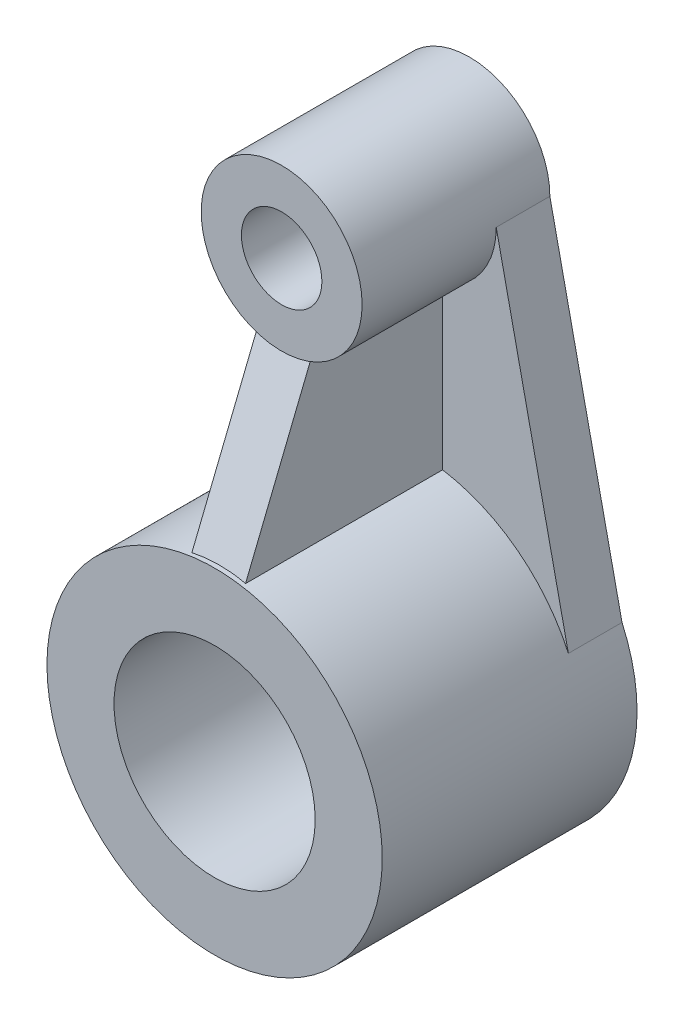
ISO-10303-21;
HEADER;
FILE_DESCRIPTION(('STEP AP214'),'2;1');
FILE_NAME('part.step','',(''),(''),'','','');
FILE_SCHEMA(('AUTOMOTIVE_DESIGN { 1 0 10303 214 1 1 1 1 }'));
ENDSEC;
DATA;
#1=APPLICATION_CONTEXT('core data for automotive mechanical design processes');
#2=APPLICATION_PROTOCOL_DEFINITION('international standard','automotive_design',2000,#1);
#3=PRODUCT_CONTEXT('',#1,'mechanical');
#4=PRODUCT('Part','Part','',(#3));
#5=PRODUCT_RELATED_PRODUCT_CATEGORY('part','',(#4));
#6=PRODUCT_DEFINITION_FORMATION('','',#4);
#7=PRODUCT_DEFINITION_CONTEXT('part definition',#1,'design');
#8=PRODUCT_DEFINITION('design','',#6,#7);
#9=PRODUCT_DEFINITION_SHAPE('','',#8);
#10=(LENGTH_UNIT() NAMED_UNIT(*) SI_UNIT(.MILLI.,.METRE.));
#11=(NAMED_UNIT(*) PLANE_ANGLE_UNIT() SI_UNIT($,.RADIAN.));
#12=(NAMED_UNIT(*) SI_UNIT($,.STERADIAN.) SOLID_ANGLE_UNIT());
#13=UNCERTAINTY_MEASURE_WITH_UNIT(LENGTH_MEASURE(1.E-05),#10,'distance_accuracy_value','');
#14=(GEOMETRIC_REPRESENTATION_CONTEXT(3) GLOBAL_UNCERTAINTY_ASSIGNED_CONTEXT((#13)) GLOBAL_UNIT_ASSIGNED_CONTEXT((#10,
#11,#12)) REPRESENTATION_CONTEXT('',''));
#15=CARTESIAN_POINT('',(0.,0.,0.));
#16=DIRECTION('',(0.,0.,1.));
#17=DIRECTION('',(1.,0.,0.));
#18=AXIS2_PLACEMENT_3D('',#15,#16,#17);
#19=CARTESIAN_POINT('',(0.,0.,-30.));
#20=DIRECTION('',(0.,0.,-1.));
#21=DIRECTION('',(-1.,0.,0.));
#22=AXIS2_PLACEMENT_3D('',#19,#20,#21);
#23=PLANE('',#22);
#24=DIRECTION('',(0.,-1.,0.));
#25=VECTOR('',#24,1.);
#26=CARTESIAN_POINT('',(-4.,0.,-30.));
#27=LINE('',#26,#25);
#28=CARTESIAN_POINT('',(-4.,55.4123837121923,-30.));
#29=VERTEX_POINT('',#28);
#30=CARTESIAN_POINT('',(-4.,31.4040175696832,-30.));
#31=VERTEX_POINT('',#30);
#32=EDGE_CURVE('E116',#29,#31,#27,.T.);
#33=ORIENTED_EDGE('',*,*,#32,.F.);
#34=CARTESIAN_POINT('',(0.,66.726092211177,-30.));
#35=DIRECTION('',(0.,0.,-1.));
#36=DIRECTION('',(-1.,0.,0.));
#37=AXIS2_PLACEMENT_3D('',#34,#35,#36);
#38=CIRCLE('',#37,12.);
#39=CARTESIAN_POINT('',(-12.,66.7260922111771,-30.));
#40=VERTEX_POINT('',#39);
#41=EDGE_CURVE('E101',#40,#29,#38,.F.);
#42=ORIENTED_EDGE('',*,*,#41,.F.);
#43=DIRECTION('',(-0.211753347005806,-0.977323140026797,0.));
#44=VECTOR('',#43,1.);
#45=CARTESIAN_POINT('',(-25.2709875098748,5.47538062713954,-30.));
#46=LINE('',#45,#44);
#47=CARTESIAN_POINT('',(-22.7580260015919,17.073664511522,-30.));
#48=VERTEX_POINT('',#47);
#49=EDGE_CURVE('E143',#40,#48,#46,.T.);
#50=ORIENTED_EDGE('',*,*,#49,.T.);
#51=CARTESIAN_POINT('',(0.,6.72609221117705,-30.));
#52=DIRECTION('',(0.,0.,-1.));
#53=DIRECTION('',(-1.,0.,0.));
#54=AXIS2_PLACEMENT_3D('',#51,#52,#53);
#55=CIRCLE('',#54,25.);
#56=EDGE_CURVE('E117',#48,#31,#55,.T.);
#57=ORIENTED_EDGE('',*,*,#56,.T.);
#58=EDGE_LOOP('',(#33,#42,#50,#57));
#59=FACE_BOUND('',#58,.T.);
#60=ADVANCED_FACE('F39',(#59),#23,.F.);
#61=CARTESIAN_POINT('',(0.,6.72609221117705,-38.));
#62=DIRECTION('',(0.,0.,1.));
#63=DIRECTION('',(1.,0.,0.));
#64=AXIS2_PLACEMENT_3D('',#61,#62,#63);
#65=CYLINDRICAL_SURFACE('',#64,25.);
#66=DIRECTION('',(0.,0.,1.));
#67=VECTOR('',#66,1.);
#68=CARTESIAN_POINT('',(4.,31.4040175696832,-38.));
#69=LINE('',#68,#67);
#70=CARTESIAN_POINT('',(4.,31.4040175696832,-0.612969449853033));
#71=VERTEX_POINT('',#70);
#72=CARTESIAN_POINT('',(4.,31.4040175696832,-30.));
#73=VERTEX_POINT('',#72);
#74=EDGE_CURVE('E54',#71,#73,#69,.F.);
#75=ORIENTED_EDGE('',*,*,#74,.F.);
#76=CARTESIAN_POINT('',(0.,6.72609221117705,9.36442892342926));
#77=DIRECTION('',(0.,-0.374828433630018,-0.927094194428197));
#78=DIRECTION('',(0.,-0.927094194428197,0.374828433630018));
#79=AXIS2_PLACEMENT_3D('',#76,#77,#78);
#80=ELLIPSE('',#79,26.965976219298,25.);
#81=CARTESIAN_POINT('',(-4.,31.4040175696832,-0.612969449853036));
#82=VERTEX_POINT('',#81);
#83=EDGE_CURVE('E58',#71,#82,#80,.F.);
#84=ORIENTED_EDGE('',*,*,#83,.T.);
#85=DIRECTION('',(0.,0.,1.));
#86=VECTOR('',#85,1.);
#87=CARTESIAN_POINT('',(-4.,31.4040175696832,-38.));
#88=LINE('',#87,#86);
#89=EDGE_CURVE('E119',#82,#31,#88,.F.);
#90=ORIENTED_EDGE('',*,*,#89,.T.);
#91=ORIENTED_EDGE('',*,*,#56,.F.);
#92=DIRECTION('',(0.,0.,-1.));
#93=VECTOR('',#92,1.);
#94=CARTESIAN_POINT('',(-22.7580260015919,17.073664511522,-30.));
#95=LINE('',#94,#93);
#96=CARTESIAN_POINT('',(-22.7580260015919,17.073664511522,-38.));
#97=VERTEX_POINT('',#96);
#98=EDGE_CURVE('E146',#48,#97,#95,.T.);
#99=ORIENTED_EDGE('',*,*,#98,.T.);
#100=CARTESIAN_POINT('',(0.,6.72609221117705,-38.));
#101=DIRECTION('',(0.,0.,1.));
#102=DIRECTION('',(1.,0.,0.));
#103=AXIS2_PLACEMENT_3D('',#100,#101,#102);
#104=CIRCLE('',#103,25.);
#105=CARTESIAN_POINT('',(22.7580260015919,17.073664511522,-38.));
#106=VERTEX_POINT('',#105);
#107=EDGE_CURVE('E131',#97,#106,#104,.T.);
#108=ORIENTED_EDGE('',*,*,#107,.T.);
#109=DIRECTION('',(0.,0.,-1.));
#110=VECTOR('',#109,1.);
#111=CARTESIAN_POINT('',(22.7580260015919,17.073664511522,-30.));
#112=LINE('',#111,#110);
#113=CARTESIAN_POINT('',(22.7580260015919,17.073664511522,-30.));
#114=VERTEX_POINT('',#113);
#115=EDGE_CURVE('E142',#114,#106,#112,.T.);
#116=ORIENTED_EDGE('',*,*,#115,.F.);
#117=EDGE_CURVE('E160',#73,#114,#55,.T.);
#118=ORIENTED_EDGE('',*,*,#117,.F.);
#119=EDGE_LOOP('',(#75,#84,#90,#91,#99,#108,#116,#118));
#120=FACE_BOUND('',#119,.T.);
#121=CARTESIAN_POINT('',(0.,6.72609221117705,0.));
#122=DIRECTION('',(0.,0.,1.));
#123=DIRECTION('',(1.,0.,0.));
#124=AXIS2_PLACEMENT_3D('',#121,#122,#123);
#125=CIRCLE('',#124,25.);
#126=CARTESIAN_POINT('',(25.,6.72609221117705,0.));
#127=VERTEX_POINT('',#126);
#128=EDGE_CURVE('E128',#127,#127,#125,.T.);
#129=ORIENTED_EDGE('',*,*,#128,.F.);
#130=EDGE_LOOP('',(#129));
#131=FACE_BOUND('',#130,.T.);
#132=ADVANCED_FACE('F41',(#120,#131),#65,.T.);
#133=CARTESIAN_POINT('',(0.,6.72609221117705,-38.));
#134=DIRECTION('',(0.,0.,1.));
#135=DIRECTION('',(1.,0.,0.));
#136=AXIS2_PLACEMENT_3D('',#133,#134,#135);
#137=PLANE('',#136);
#138=DIRECTION('',(-0.211753347005806,-0.977323140026797,0.));
#139=VECTOR('',#138,1.);
#140=CARTESIAN_POINT('',(-25.2709875098748,5.47538062713954,-38.));
#141=LINE('',#140,#139);
#142=CARTESIAN_POINT('',(-12.,66.726092211177,-38.));
#143=VERTEX_POINT('',#142);
#144=EDGE_CURVE('E150',#143,#97,#141,.T.);
#145=ORIENTED_EDGE('',*,*,#144,.F.);
#146=CARTESIAN_POINT('',(0.,66.726092211177,-38.));
#147=DIRECTION('',(0.,0.,-1.));
#148=DIRECTION('',(-1.,0.,0.));
#149=AXIS2_PLACEMENT_3D('',#146,#147,#148);
#150=CIRCLE('',#149,12.);
#151=CARTESIAN_POINT('',(12.,66.726092211177,-38.));
#152=VERTEX_POINT('',#151);
#153=EDGE_CURVE('E171',#143,#152,#150,.T.);
#154=ORIENTED_EDGE('',*,*,#153,.T.);
#155=DIRECTION('',(-0.211753347005806,0.977323140026797,0.));
#156=VECTOR('',#155,1.);
#157=CARTESIAN_POINT('',(25.2709875098748,5.47538062713953,-38.));
#158=LINE('',#157,#156);
#159=EDGE_CURVE('E154',#106,#152,#158,.T.);
#160=ORIENTED_EDGE('',*,*,#159,.F.);
#161=ORIENTED_EDGE('',*,*,#107,.F.);
#162=EDGE_LOOP('',(#145,#154,#160,#161));
#163=FACE_BOUND('',#162,.T.);
#164=CARTESIAN_POINT('',(0.,6.72609221117705,-38.));
#165=DIRECTION('',(0.,0.,1.));
#166=DIRECTION('',(1.,0.,0.));
#167=AXIS2_PLACEMENT_3D('',#164,#165,#166);
#168=CIRCLE('',#167,15.);
#169=CARTESIAN_POINT('',(15.,6.72609221117705,-38.));
#170=VERTEX_POINT('',#169);
#171=EDGE_CURVE('E132',#170,#170,#168,.T.);
#172=ORIENTED_EDGE('',*,*,#171,.T.);
#173=EDGE_LOOP('',(#172));
#174=FACE_BOUND('',#173,.T.);
#175=CARTESIAN_POINT('',(0.,66.726092211177,-38.));
#176=DIRECTION('',(0.,0.,-1.));
#177=DIRECTION('',(-1.,0.,0.));
#178=AXIS2_PLACEMENT_3D('',#175,#176,#177);
#179=CIRCLE('',#178,6.);
#180=CARTESIAN_POINT('',(-5.99999999999999,66.726092211177,-38.));
#181=VERTEX_POINT('',#180);
#182=EDGE_CURVE('E168',#181,#181,#179,.F.);
#183=ORIENTED_EDGE('',*,*,#182,.T.);
#184=EDGE_LOOP('',(#183));
#185=FACE_BOUND('',#184,.T.);
#186=ADVANCED_FACE('F198',(#163,#174,#185),#137,.F.);
#187=CARTESIAN_POINT('',(0.,6.72609221117705,0.));
#188=DIRECTION('',(0.,0.,1.));
#189=DIRECTION('',(1.,0.,0.));
#190=AXIS2_PLACEMENT_3D('',#187,#188,#189);
#191=PLANE('',#190);
#192=CARTESIAN_POINT('',(0.,6.72609221117705,0.));
#193=DIRECTION('',(0.,0.,1.));
#194=DIRECTION('',(1.,0.,0.));
#195=AXIS2_PLACEMENT_3D('',#192,#193,#194);
#196=CIRCLE('',#195,15.);
#197=CARTESIAN_POINT('',(15.,6.72609221117705,0.));
#198=VERTEX_POINT('',#197);
#199=EDGE_CURVE('E134',#198,#198,#196,.T.);
#200=ORIENTED_EDGE('',*,*,#199,.F.);
#201=EDGE_LOOP('',(#200));
#202=FACE_BOUND('',#201,.T.);
#203=ORIENTED_EDGE('',*,*,#128,.T.);
#204=EDGE_LOOP('',(#203));
#205=FACE_BOUND('',#204,.T.);
#206=ADVANCED_FACE('F207',(#202,#205),#191,.T.);
#207=CARTESIAN_POINT('',(0.,6.72609221117705,-38.));
#208=DIRECTION('',(0.,0.,1.));
#209=DIRECTION('',(1.,0.,0.));
#210=AXIS2_PLACEMENT_3D('',#207,#208,#209);
#211=CYLINDRICAL_SURFACE('',#210,15.);
#212=ORIENTED_EDGE('',*,*,#171,.F.);
#213=EDGE_LOOP('',(#212));
#214=FACE_BOUND('',#213,.T.);
#215=ORIENTED_EDGE('',*,*,#199,.T.);
#216=EDGE_LOOP('',(#215));
#217=FACE_BOUND('',#216,.T.);
#218=ADVANCED_FACE('F209',(#214,#217),#211,.F.);
#219=CARTESIAN_POINT('',(-25.2709875098748,5.47538062713954,-30.));
#220=DIRECTION('',(0.977323140026797,-0.211753347005806,0.));
#221=DIRECTION('',(0.211753347005806,0.977323140026797,0.));
#222=AXIS2_PLACEMENT_3D('',#219,#220,#221);
#223=PLANE('',#222);
#224=ORIENTED_EDGE('',*,*,#144,.T.);
#225=ORIENTED_EDGE('',*,*,#98,.F.);
#226=ORIENTED_EDGE('',*,*,#49,.F.);
#227=DIRECTION('',(0.,0.,-1.));
#228=VECTOR('',#227,1.);
#229=CARTESIAN_POINT('',(-12.,66.7260922111771,-30.));
#230=LINE('',#229,#228);
#231=EDGE_CURVE('E108',#40,#143,#230,.T.);
#232=ORIENTED_EDGE('',*,*,#231,.T.);
#233=EDGE_LOOP('',(#224,#225,#226,#232));
#234=FACE_BOUND('',#233,.T.);
#235=ADVANCED_FACE('F202',(#234),#223,.F.);
#236=CARTESIAN_POINT('',(25.2709875098748,5.47538062713953,-30.));
#237=DIRECTION('',(-0.977323140026797,-0.211753347005806,0.));
#238=DIRECTION('',(0.211753347005806,-0.977323140026797,0.));
#239=AXIS2_PLACEMENT_3D('',#236,#237,#238);
#240=PLANE('',#239);
#241=ORIENTED_EDGE('',*,*,#159,.T.);
#242=DIRECTION('',(0.,0.,-1.));
#243=VECTOR('',#242,1.);
#244=CARTESIAN_POINT('',(12.,66.7260922111771,-30.));
#245=LINE('',#244,#243);
#246=CARTESIAN_POINT('',(12.,66.726092211177,-30.));
#247=VERTEX_POINT('',#246);
#248=EDGE_CURVE('E139',#247,#152,#245,.T.);
#249=ORIENTED_EDGE('',*,*,#248,.F.);
#250=DIRECTION('',(-0.211753347005806,0.977323140026797,0.));
#251=VECTOR('',#250,1.);
#252=CARTESIAN_POINT('',(25.2709875098748,5.47538062713953,-30.));
#253=LINE('',#252,#251);
#254=EDGE_CURVE('E153',#114,#247,#253,.T.);
#255=ORIENTED_EDGE('',*,*,#254,.F.);
#256=ORIENTED_EDGE('',*,*,#115,.T.);
#257=EDGE_LOOP('',(#241,#249,#255,#256));
#258=FACE_BOUND('',#257,.T.);
#259=ADVANCED_FACE('F194',(#258),#240,.F.);
#260=CARTESIAN_POINT('',(4.,55.4123837121923,-30.));
#261=VERTEX_POINT('',#260);
#262=EDGE_CURVE('E112',#261,#247,#38,.F.);
#263=ORIENTED_EDGE('',*,*,#262,.F.);
#264=DIRECTION('',(0.,-1.,0.));
#265=VECTOR('',#264,1.);
#266=CARTESIAN_POINT('',(4.,0.,-30.));
#267=LINE('',#266,#265);
#268=EDGE_CURVE('E175',#261,#73,#267,.T.);
#269=ORIENTED_EDGE('',*,*,#268,.T.);
#270=ORIENTED_EDGE('',*,*,#117,.T.);
#271=ORIENTED_EDGE('',*,*,#254,.T.);
#272=EDGE_LOOP('',(#263,#269,#270,#271));
#273=FACE_BOUND('',#272,.T.);
#274=ADVANCED_FACE('F190',(#273),#23,.F.);
#275=CARTESIAN_POINT('',(0.,66.726092211177,-10.));
#276=DIRECTION('',(0.,0.,-1.));
#277=DIRECTION('',(-1.,0.,0.));
#278=AXIS2_PLACEMENT_3D('',#275,#276,#277);
#279=CYLINDRICAL_SURFACE('',#278,6.);
#280=CARTESIAN_POINT('',(0.,66.726092211177,-10.));
#281=DIRECTION('',(0.,0.,1.));
#282=DIRECTION('',(1.,0.,0.));
#283=AXIS2_PLACEMENT_3D('',#280,#281,#282);
#284=CIRCLE('',#283,6.);
#285=CARTESIAN_POINT('',(6.00000000000001,66.726092211177,-10.));
#286=VERTEX_POINT('',#285);
#287=EDGE_CURVE('E165',#286,#286,#284,.T.);
#288=ORIENTED_EDGE('',*,*,#287,.T.);
#289=EDGE_LOOP('',(#288));
#290=FACE_BOUND('',#289,.T.);
#291=ORIENTED_EDGE('',*,*,#182,.F.);
#292=EDGE_LOOP('',(#291));
#293=FACE_BOUND('',#292,.T.);
#294=ADVANCED_FACE('F226',(#290,#293),#279,.F.);
#295=CARTESIAN_POINT('',(0.,66.726092211177,-10.));
#296=DIRECTION('',(0.,0.,-1.));
#297=DIRECTION('',(-1.,0.,0.));
#298=AXIS2_PLACEMENT_3D('',#295,#296,#297);
#299=CYLINDRICAL_SURFACE('',#298,12.);
#300=CARTESIAN_POINT('',(0.,66.726092211177,-10.));
#301=DIRECTION('',(0.,0.,1.));
#302=DIRECTION('',(1.,0.,0.));
#303=AXIS2_PLACEMENT_3D('',#300,#301,#302);
#304=CIRCLE('',#303,12.);
#305=CARTESIAN_POINT('',(12.,66.726092211177,-10.));
#306=VERTEX_POINT('',#305);
#307=EDGE_CURVE('E157',#306,#306,#304,.T.);
#308=ORIENTED_EDGE('',*,*,#307,.F.);
#309=EDGE_LOOP('',(#308));
#310=FACE_BOUND('',#309,.T.);
#311=CARTESIAN_POINT('',(0.,66.726092211177,-14.8938461827718));
#312=DIRECTION('',(0.,-0.374828433630018,-0.927094194428197));
#313=DIRECTION('',(0.,0.927094194428197,-0.374828433630018));
#314=AXIS2_PLACEMENT_3D('',#311,#312,#313);
#315=ELLIPSE('',#314,12.943668585263,12.);
#316=CARTESIAN_POINT('',(4.,55.4123837121923,-10.3196619621095));
#317=VERTEX_POINT('',#316);
#318=CARTESIAN_POINT('',(-4.,55.4123837121923,-10.3196619621095));
#319=VERTEX_POINT('',#318);
#320=EDGE_CURVE('E47',#317,#319,#315,.T.);
#321=ORIENTED_EDGE('',*,*,#320,.F.);
#322=DIRECTION('',(0.,0.,-1.));
#323=VECTOR('',#322,1.);
#324=CARTESIAN_POINT('',(4.,55.4123837121923,-10.));
#325=LINE('',#324,#323);
#326=EDGE_CURVE('E11',#317,#261,#325,.T.);
#327=ORIENTED_EDGE('',*,*,#326,.T.);
#328=ORIENTED_EDGE('',*,*,#262,.T.);
#329=ORIENTED_EDGE('',*,*,#248,.T.);
#330=ORIENTED_EDGE('',*,*,#153,.F.);
#331=ORIENTED_EDGE('',*,*,#231,.F.);
#332=ORIENTED_EDGE('',*,*,#41,.T.);
#333=DIRECTION('',(0.,0.,-1.));
#334=VECTOR('',#333,1.);
#335=CARTESIAN_POINT('',(-4.,55.4123837121923,-10.));
#336=LINE('',#335,#334);
#337=EDGE_CURVE('E105',#319,#29,#336,.T.);
#338=ORIENTED_EDGE('',*,*,#337,.F.);
#339=EDGE_LOOP('',(#321,#327,#328,#329,#330,#331,#332,#338));
#340=FACE_BOUND('',#339,.T.);
#341=ADVANCED_FACE('F103',(#310,#340),#299,.T.);
#342=CARTESIAN_POINT('',(0.,0.,-10.));
#343=DIRECTION('',(0.,0.,1.));
#344=DIRECTION('',(1.,0.,0.));
#345=AXIS2_PLACEMENT_3D('',#342,#343,#344);
#346=PLANE('',#345);
#347=ORIENTED_EDGE('',*,*,#287,.F.);
#348=EDGE_LOOP('',(#347));
#349=FACE_BOUND('',#348,.T.);
#350=ORIENTED_EDGE('',*,*,#307,.T.);
#351=EDGE_LOOP('',(#350));
#352=FACE_BOUND('',#351,.T.);
#353=ADVANCED_FACE('F250',(#349,#352),#346,.T.);
#354=CARTESIAN_POINT('',(4.,56.8072544310241,-10.8836145893597));
#355=DIRECTION('',(0.,-0.374828433630018,-0.927094194428197));
#356=DIRECTION('',(0.,0.927094194428197,-0.374828433630018));
#357=AXIS2_PLACEMENT_3D('',#354,#355,#356);
#358=PLANE('',#357);
#359=ORIENTED_EDGE('',*,*,#83,.F.);
#360=DIRECTION('',(0.,-0.927094194428197,0.374828433630018));
#361=VECTOR('',#360,1.);
#362=CARTESIAN_POINT('',(4.,56.8072544310241,-10.8836145893597));
#363=LINE('',#362,#361);
#364=EDGE_CURVE('E120',#317,#71,#363,.T.);
#365=ORIENTED_EDGE('',*,*,#364,.F.);
#366=ORIENTED_EDGE('',*,*,#320,.T.);
#367=DIRECTION('',(0.,-0.927094194428197,0.374828433630018));
#368=VECTOR('',#367,1.);
#369=CARTESIAN_POINT('',(-4.,56.8072544310241,-10.8836145893597));
#370=LINE('',#369,#368);
#371=EDGE_CURVE('E125',#319,#82,#370,.T.);
#372=ORIENTED_EDGE('',*,*,#371,.T.);
#373=EDGE_LOOP('',(#359,#365,#366,#372));
#374=FACE_BOUND('',#373,.T.);
#375=ADVANCED_FACE('F186',(#374),#358,.F.);
#376=CARTESIAN_POINT('',(4.,0.,0.));
#377=DIRECTION('',(1.,0.,0.));
#378=DIRECTION('',(0.,0.,-1.));
#379=AXIS2_PLACEMENT_3D('',#376,#377,#378);
#380=PLANE('',#379);
#381=ORIENTED_EDGE('',*,*,#364,.T.);
#382=ORIENTED_EDGE('',*,*,#74,.T.);
#383=ORIENTED_EDGE('',*,*,#268,.F.);
#384=ORIENTED_EDGE('',*,*,#326,.F.);
#385=EDGE_LOOP('',(#381,#382,#383,#384));
#386=FACE_BOUND('',#385,.T.);
#387=ADVANCED_FACE('F183',(#386),#380,.T.);
#388=CARTESIAN_POINT('',(-4.,0.,0.));
#389=DIRECTION('',(1.,0.,0.));
#390=DIRECTION('',(0.,0.,-1.));
#391=AXIS2_PLACEMENT_3D('',#388,#389,#390);
#392=PLANE('',#391);
#393=ORIENTED_EDGE('',*,*,#89,.F.);
#394=ORIENTED_EDGE('',*,*,#371,.F.);
#395=ORIENTED_EDGE('',*,*,#337,.T.);
#396=ORIENTED_EDGE('',*,*,#32,.T.);
#397=EDGE_LOOP('',(#393,#394,#395,#396));
#398=FACE_BOUND('',#397,.T.);
#399=ADVANCED_FACE('F123',(#398),#392,.F.);
#400=CLOSED_SHELL('',(#60,#132,#186,#206,#218,#235,#259,#274,#294,#341,#353,#375,#387,#399));
#401=MANIFOLD_SOLID_BREP('B2',#400);
#402=ADVANCED_BREP_SHAPE_REPRESENTATION('',(#18,#401),#14);
#403=SHAPE_DEFINITION_REPRESENTATION(#9,#402);
ENDSEC;
END-ISO-10303-21;
